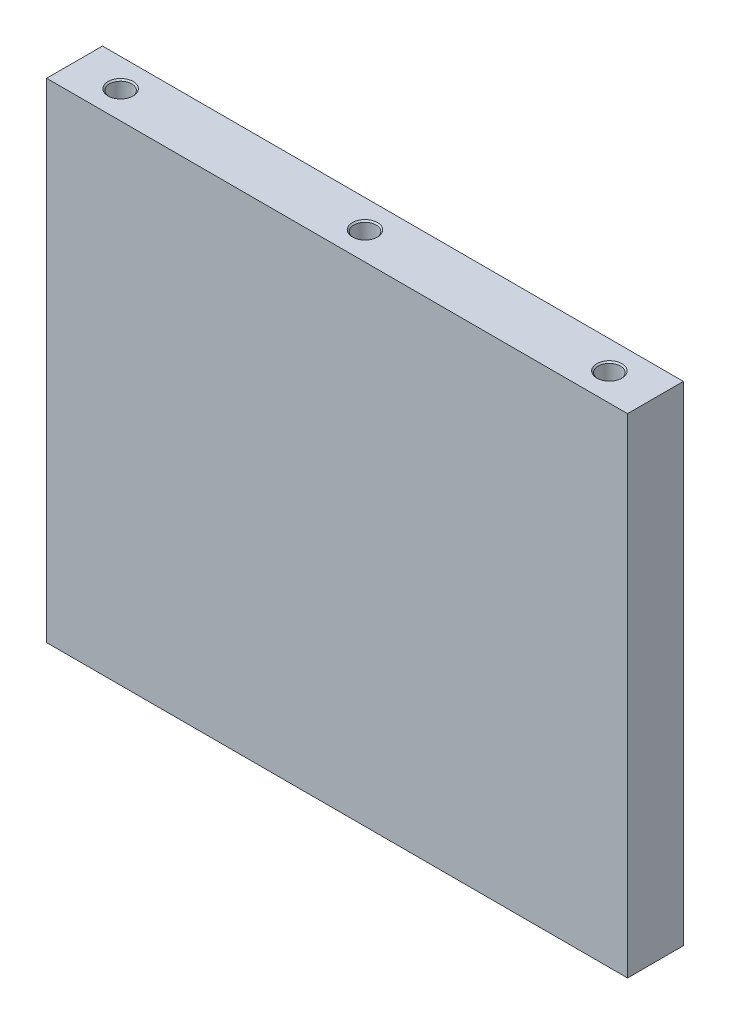
ISO-10303-21;
HEADER;
FILE_DESCRIPTION(('STEP AP214'),'2;1');
FILE_NAME('part.step','',(''),(''),'','','');
FILE_SCHEMA(('AUTOMOTIVE_DESIGN { 1 0 10303 214 1 1 1 1 }'));
ENDSEC;
DATA;
#1=APPLICATION_CONTEXT('core data for automotive mechanical design processes');
#2=APPLICATION_PROTOCOL_DEFINITION('international standard','automotive_design',2000,#1);
#3=PRODUCT_CONTEXT('',#1,'mechanical');
#4=PRODUCT('Part','Part','',(#3));
#5=PRODUCT_RELATED_PRODUCT_CATEGORY('part','',(#4));
#6=PRODUCT_DEFINITION_FORMATION('','',#4);
#7=PRODUCT_DEFINITION_CONTEXT('part definition',#1,'design');
#8=PRODUCT_DEFINITION('design','',#6,#7);
#9=PRODUCT_DEFINITION_SHAPE('','',#8);
#10=(LENGTH_UNIT() NAMED_UNIT(*) SI_UNIT(.MILLI.,.METRE.));
#11=(NAMED_UNIT(*) PLANE_ANGLE_UNIT() SI_UNIT($,.RADIAN.));
#12=(NAMED_UNIT(*) SI_UNIT($,.STERADIAN.) SOLID_ANGLE_UNIT());
#13=UNCERTAINTY_MEASURE_WITH_UNIT(LENGTH_MEASURE(1.E-05),#10,'distance_accuracy_value','');
#14=(GEOMETRIC_REPRESENTATION_CONTEXT(3) GLOBAL_UNCERTAINTY_ASSIGNED_CONTEXT((#13)) GLOBAL_UNIT_ASSIGNED_CONTEXT((#10,
#11,#12)) REPRESENTATION_CONTEXT('',''));
#15=CARTESIAN_POINT('',(0.,0.,0.));
#16=DIRECTION('',(0.,0.,1.));
#17=DIRECTION('',(1.,0.,0.));
#18=AXIS2_PLACEMENT_3D('',#15,#16,#17);
#19=CARTESIAN_POINT('',(-104.,175.,9.99999999999998));
#20=DIRECTION('',(1.,0.,0.));
#21=DIRECTION('',(0.,0.,-1.));
#22=AXIS2_PLACEMENT_3D('',#19,#20,#21);
#23=PLANE('',#22);
#24=DIRECTION('',(0.,0.,1.));
#25=VECTOR('',#24,1.);
#26=CARTESIAN_POINT('',(-104.,0.,9.99999999999998));
#27=LINE('',#26,#25);
#28=CARTESIAN_POINT('',(-104.,0.,-9.99999999999999));
#29=VERTEX_POINT('',#28);
#30=CARTESIAN_POINT('',(-104.,0.,9.99999999999998));
#31=VERTEX_POINT('',#30);
#32=EDGE_CURVE('E112',#29,#31,#27,.T.);
#33=ORIENTED_EDGE('',*,*,#32,.T.);
#34=DIRECTION('',(0.,-1.,0.));
#35=VECTOR('',#34,1.);
#36=CARTESIAN_POINT('',(-104.,175.,9.99999999999998));
#37=LINE('',#36,#35);
#38=CARTESIAN_POINT('',(-104.,175.,9.99999999999998));
#39=VERTEX_POINT('',#38);
#40=EDGE_CURVE('E103',#39,#31,#37,.T.);
#41=ORIENTED_EDGE('',*,*,#40,.F.);
#42=DIRECTION('',(0.,0.,1.));
#43=VECTOR('',#42,1.);
#44=CARTESIAN_POINT('',(-104.,175.,9.99999999999998));
#45=LINE('',#44,#43);
#46=CARTESIAN_POINT('',(-104.,175.,-9.99999999999999));
#47=VERTEX_POINT('',#46);
#48=EDGE_CURVE('E97',#47,#39,#45,.T.);
#49=ORIENTED_EDGE('',*,*,#48,.F.);
#50=DIRECTION('',(0.,-1.,0.));
#51=VECTOR('',#50,1.);
#52=CARTESIAN_POINT('',(-104.,175.,-9.99999999999999));
#53=LINE('',#52,#51);
#54=EDGE_CURVE('E108',#47,#29,#53,.T.);
#55=ORIENTED_EDGE('',*,*,#54,.T.);
#56=EDGE_LOOP('',(#33,#41,#49,#55));
#57=FACE_BOUND('',#56,.T.);
#58=ADVANCED_FACE('F44',(#57),#23,.F.);
#59=CARTESIAN_POINT('',(-104.,175.,9.99999999999998));
#60=DIRECTION('',(0.,0.,-1.));
#61=DIRECTION('',(-1.,0.,0.));
#62=AXIS2_PLACEMENT_3D('',#59,#60,#61);
#63=PLANE('',#62);
#64=DIRECTION('',(1.,0.,0.));
#65=VECTOR('',#64,1.);
#66=CARTESIAN_POINT('',(-104.,0.,9.99999999999998));
#67=LINE('',#66,#65);
#68=CARTESIAN_POINT('',(104.,0.,10.));
#69=VERTEX_POINT('',#68);
#70=EDGE_CURVE('E102',#31,#69,#67,.T.);
#71=ORIENTED_EDGE('',*,*,#70,.T.);
#72=DIRECTION('',(0.,-1.,0.));
#73=VECTOR('',#72,1.);
#74=CARTESIAN_POINT('',(104.,175.,10.));
#75=LINE('',#74,#73);
#76=CARTESIAN_POINT('',(104.,175.,10.));
#77=VERTEX_POINT('',#76);
#78=EDGE_CURVE('E100',#77,#69,#75,.T.);
#79=ORIENTED_EDGE('',*,*,#78,.F.);
#80=DIRECTION('',(1.,0.,0.));
#81=VECTOR('',#80,1.);
#82=CARTESIAN_POINT('',(-104.,175.,9.99999999999998));
#83=LINE('',#82,#81);
#84=EDGE_CURVE('E92',#39,#77,#83,.T.);
#85=ORIENTED_EDGE('',*,*,#84,.F.);
#86=ORIENTED_EDGE('',*,*,#40,.T.);
#87=EDGE_LOOP('',(#71,#79,#85,#86));
#88=FACE_BOUND('',#87,.T.);
#89=ADVANCED_FACE('F101',(#88),#63,.F.);
#90=CARTESIAN_POINT('',(104.,175.,10.));
#91=DIRECTION('',(-1.,0.,0.));
#92=DIRECTION('',(0.,0.,1.));
#93=AXIS2_PLACEMENT_3D('',#90,#91,#92);
#94=PLANE('',#93);
#95=DIRECTION('',(0.,0.,-1.));
#96=VECTOR('',#95,1.);
#97=CARTESIAN_POINT('',(104.,0.,10.));
#98=LINE('',#97,#96);
#99=CARTESIAN_POINT('',(104.,0.,-9.99999999999999));
#100=VERTEX_POINT('',#99);
#101=EDGE_CURVE('E78',#69,#100,#98,.T.);
#102=ORIENTED_EDGE('',*,*,#101,.T.);
#103=DIRECTION('',(0.,-1.,0.));
#104=VECTOR('',#103,1.);
#105=CARTESIAN_POINT('',(104.,175.,-9.99999999999999));
#106=LINE('',#105,#104);
#107=CARTESIAN_POINT('',(104.,175.,-9.99999999999999));
#108=VERTEX_POINT('',#107);
#109=EDGE_CURVE('E104',#108,#100,#106,.T.);
#110=ORIENTED_EDGE('',*,*,#109,.F.);
#111=DIRECTION('',(0.,0.,-1.));
#112=VECTOR('',#111,1.);
#113=CARTESIAN_POINT('',(104.,175.,10.));
#114=LINE('',#113,#112);
#115=EDGE_CURVE('E95',#77,#108,#114,.T.);
#116=ORIENTED_EDGE('',*,*,#115,.F.);
#117=ORIENTED_EDGE('',*,*,#78,.T.);
#118=EDGE_LOOP('',(#102,#110,#116,#117));
#119=FACE_BOUND('',#118,.T.);
#120=ADVANCED_FACE('F106',(#119),#94,.F.);
#121=CARTESIAN_POINT('',(-104.,175.,-9.99999999999999));
#122=DIRECTION('',(0.,0.,1.));
#123=DIRECTION('',(1.,0.,0.));
#124=AXIS2_PLACEMENT_3D('',#121,#122,#123);
#125=PLANE('',#124);
#126=DIRECTION('',(-1.,0.,0.));
#127=VECTOR('',#126,1.);
#128=CARTESIAN_POINT('',(-104.,0.,-9.99999999999999));
#129=LINE('',#128,#127);
#130=EDGE_CURVE('E84',#100,#29,#129,.T.);
#131=ORIENTED_EDGE('',*,*,#130,.T.);
#132=ORIENTED_EDGE('',*,*,#54,.F.);
#133=DIRECTION('',(-1.,0.,0.));
#134=VECTOR('',#133,1.);
#135=CARTESIAN_POINT('',(-104.,175.,-9.99999999999999));
#136=LINE('',#135,#134);
#137=EDGE_CURVE('E61',#108,#47,#136,.T.);
#138=ORIENTED_EDGE('',*,*,#137,.F.);
#139=ORIENTED_EDGE('',*,*,#109,.T.);
#140=EDGE_LOOP('',(#131,#132,#138,#139));
#141=FACE_BOUND('',#140,.T.);
#142=ADVANCED_FACE('F225',(#141),#125,.F.);
#143=CARTESIAN_POINT('',(0.,175.,0.));
#144=DIRECTION('',(0.,-1.,0.));
#145=DIRECTION('',(0.,0.,-1.));
#146=AXIS2_PLACEMENT_3D('',#143,#144,#145);
#147=PLANE('',#146);
#148=CARTESIAN_POINT('',(87.5,175.,0.));
#149=DIRECTION('',(0.,-1.,0.));
#150=DIRECTION('',(0.,0.,-1.));
#151=AXIS2_PLACEMENT_3D('',#148,#149,#150);
#152=CIRCLE('',#151,4.50000000000003);
#153=CARTESIAN_POINT('',(87.5,175.,-4.50000000000005));
#154=VERTEX_POINT('',#153);
#155=EDGE_CURVE('E143',#154,#154,#152,.T.);
#156=ORIENTED_EDGE('',*,*,#155,.T.);
#157=EDGE_LOOP('',(#156));
#158=FACE_BOUND('',#157,.T.);
#159=CARTESIAN_POINT('',(0.,175.,0.));
#160=DIRECTION('',(0.,-1.,0.));
#161=DIRECTION('',(0.,0.,-1.));
#162=AXIS2_PLACEMENT_3D('',#159,#160,#161);
#163=CIRCLE('',#162,4.50000000000003);
#164=CARTESIAN_POINT('',(0.,175.,-4.50000000000003));
#165=VERTEX_POINT('',#164);
#166=EDGE_CURVE('E140',#165,#165,#163,.T.);
#167=ORIENTED_EDGE('',*,*,#166,.T.);
#168=EDGE_LOOP('',(#167));
#169=FACE_BOUND('',#168,.T.);
#170=CARTESIAN_POINT('',(-87.5,175.,0.));
#171=DIRECTION('',(0.,-1.,0.));
#172=DIRECTION('',(0.,0.,-1.));
#173=AXIS2_PLACEMENT_3D('',#170,#171,#172);
#174=CIRCLE('',#173,4.50000000000003);
#175=CARTESIAN_POINT('',(-87.5,175.,-4.50000000000003));
#176=VERTEX_POINT('',#175);
#177=EDGE_CURVE('E137',#176,#176,#174,.T.);
#178=ORIENTED_EDGE('',*,*,#177,.T.);
#179=EDGE_LOOP('',(#178));
#180=FACE_BOUND('',#179,.T.);
#181=ORIENTED_EDGE('',*,*,#48,.T.);
#182=ORIENTED_EDGE('',*,*,#84,.T.);
#183=ORIENTED_EDGE('',*,*,#115,.T.);
#184=ORIENTED_EDGE('',*,*,#137,.T.);
#185=EDGE_LOOP('',(#181,#182,#183,#184));
#186=FACE_BOUND('',#185,.T.);
#187=ADVANCED_FACE('F93',(#158,#169,#180,#186),#147,.F.);
#188=CARTESIAN_POINT('',(0.,0.,0.));
#189=DIRECTION('',(0.,-1.,0.));
#190=DIRECTION('',(0.,0.,-1.));
#191=AXIS2_PLACEMENT_3D('',#188,#189,#190);
#192=PLANE('',#191);
#193=CARTESIAN_POINT('',(-55.,0.,0.));
#194=DIRECTION('',(0.,-1.,0.));
#195=DIRECTION('',(0.,0.,-1.));
#196=AXIS2_PLACEMENT_3D('',#193,#194,#195);
#197=CIRCLE('',#196,4.49999999999998);
#198=CARTESIAN_POINT('',(-55.,0.,-4.49999999999998));
#199=VERTEX_POINT('',#198);
#200=EDGE_CURVE('E128',#199,#199,#197,.F.);
#201=ORIENTED_EDGE('',*,*,#200,.T.);
#202=EDGE_LOOP('',(#201));
#203=FACE_BOUND('',#202,.T.);
#204=CARTESIAN_POINT('',(55.,0.,0.));
#205=DIRECTION('',(0.,-1.,0.));
#206=DIRECTION('',(0.,0.,-1.));
#207=AXIS2_PLACEMENT_3D('',#204,#205,#206);
#208=CIRCLE('',#207,4.49999999999998);
#209=CARTESIAN_POINT('',(55.,0.,-4.49999999999998));
#210=VERTEX_POINT('',#209);
#211=EDGE_CURVE('E125',#210,#210,#208,.F.);
#212=ORIENTED_EDGE('',*,*,#211,.T.);
#213=EDGE_LOOP('',(#212));
#214=FACE_BOUND('',#213,.T.);
#215=ORIENTED_EDGE('',*,*,#32,.F.);
#216=ORIENTED_EDGE('',*,*,#130,.F.);
#217=ORIENTED_EDGE('',*,*,#101,.F.);
#218=ORIENTED_EDGE('',*,*,#70,.F.);
#219=EDGE_LOOP('',(#215,#216,#217,#218));
#220=FACE_BOUND('',#219,.T.);
#221=ADVANCED_FACE('F212',(#203,#214,#220),#192,.T.);
#222=CARTESIAN_POINT('',(0.,163.,0.));
#223=DIRECTION('',(0.,1.,0.));
#224=DIRECTION('',(0.,0.,1.));
#225=AXIS2_PLACEMENT_3D('',#222,#223,#224);
#226=CYLINDRICAL_SURFACE('',#225,4.);
#227=CARTESIAN_POINT('',(0.,174.5,0.));
#228=DIRECTION('',(0.,-1.,0.));
#229=DIRECTION('',(0.,0.,-1.));
#230=AXIS2_PLACEMENT_3D('',#227,#228,#229);
#231=CIRCLE('',#230,4.);
#232=CARTESIAN_POINT('',(0.,174.5,-4.));
#233=VERTEX_POINT('',#232);
#234=EDGE_CURVE('E53',#233,#233,#231,.F.);
#235=ORIENTED_EDGE('',*,*,#234,.T.);
#236=EDGE_LOOP('',(#235));
#237=FACE_BOUND('',#236,.T.);
#238=CARTESIAN_POINT('',(0.,163.,0.));
#239=DIRECTION('',(0.,1.,0.));
#240=DIRECTION('',(0.,0.,1.));
#241=AXIS2_PLACEMENT_3D('',#238,#239,#240);
#242=CIRCLE('',#241,4.);
#243=CARTESIAN_POINT('',(0.,163.,4.));
#244=VERTEX_POINT('',#243);
#245=EDGE_CURVE('E115',#244,#244,#242,.T.);
#246=ORIENTED_EDGE('',*,*,#245,.F.);
#247=EDGE_LOOP('',(#246));
#248=FACE_BOUND('',#247,.T.);
#249=ADVANCED_FACE('F148',(#237,#248),#226,.F.);
#250=CARTESIAN_POINT('',(0.,163.,0.));
#251=DIRECTION('',(0.,1.,0.));
#252=DIRECTION('',(0.,0.,1.));
#253=AXIS2_PLACEMENT_3D('',#250,#251,#252);
#254=PLANE('',#253);
#255=ORIENTED_EDGE('',*,*,#245,.T.);
#256=EDGE_LOOP('',(#255));
#257=FACE_BOUND('',#256,.T.);
#258=ADVANCED_FACE('F210',(#257),#254,.T.);
#259=CARTESIAN_POINT('',(-87.5,163.,0.));
#260=DIRECTION('',(0.,1.,0.));
#261=DIRECTION('',(0.,0.,1.));
#262=AXIS2_PLACEMENT_3D('',#259,#260,#261);
#263=CYLINDRICAL_SURFACE('',#262,4.00000000000001);
#264=CARTESIAN_POINT('',(-87.5,174.5,0.));
#265=DIRECTION('',(0.,-1.,0.));
#266=DIRECTION('',(0.,0.,-1.));
#267=AXIS2_PLACEMENT_3D('',#264,#265,#266);
#268=CIRCLE('',#267,4.00000000000001);
#269=CARTESIAN_POINT('',(-87.5,174.5,-4.00000000000001));
#270=VERTEX_POINT('',#269);
#271=EDGE_CURVE('E13',#270,#270,#268,.F.);
#272=ORIENTED_EDGE('',*,*,#271,.T.);
#273=EDGE_LOOP('',(#272));
#274=FACE_BOUND('',#273,.T.);
#275=CARTESIAN_POINT('',(-87.5,163.,0.));
#276=DIRECTION('',(0.,1.,0.));
#277=DIRECTION('',(0.,0.,1.));
#278=AXIS2_PLACEMENT_3D('',#275,#276,#277);
#279=CIRCLE('',#278,4.00000000000001);
#280=CARTESIAN_POINT('',(-87.5,163.,4.00000000000001));
#281=VERTEX_POINT('',#280);
#282=EDGE_CURVE('E202',#281,#281,#279,.T.);
#283=ORIENTED_EDGE('',*,*,#282,.F.);
#284=EDGE_LOOP('',(#283));
#285=FACE_BOUND('',#284,.T.);
#286=ADVANCED_FACE('F218',(#274,#285),#263,.F.);
#287=CARTESIAN_POINT('',(-87.5,163.,0.));
#288=DIRECTION('',(0.,1.,0.));
#289=DIRECTION('',(0.,0.,1.));
#290=AXIS2_PLACEMENT_3D('',#287,#288,#289);
#291=PLANE('',#290);
#292=ORIENTED_EDGE('',*,*,#282,.T.);
#293=EDGE_LOOP('',(#292));
#294=FACE_BOUND('',#293,.T.);
#295=ADVANCED_FACE('F262',(#294),#291,.T.);
#296=CARTESIAN_POINT('',(87.5,163.,0.));
#297=DIRECTION('',(0.,1.,0.));
#298=DIRECTION('',(0.,0.,1.));
#299=AXIS2_PLACEMENT_3D('',#296,#297,#298);
#300=CYLINDRICAL_SURFACE('',#299,4.00000000000001);
#301=CARTESIAN_POINT('',(87.5,174.5,0.));
#302=DIRECTION('',(0.,-1.,0.));
#303=DIRECTION('',(0.,0.,-1.));
#304=AXIS2_PLACEMENT_3D('',#301,#302,#303);
#305=CIRCLE('',#304,4.00000000000001);
#306=CARTESIAN_POINT('',(87.5,174.5,-4.00000000000003));
#307=VERTEX_POINT('',#306);
#308=EDGE_CURVE('E134',#307,#307,#305,.F.);
#309=ORIENTED_EDGE('',*,*,#308,.T.);
#310=EDGE_LOOP('',(#309));
#311=FACE_BOUND('',#310,.T.);
#312=CARTESIAN_POINT('',(87.5,163.,0.));
#313=DIRECTION('',(0.,1.,0.));
#314=DIRECTION('',(0.,0.,-1.));
#315=AXIS2_PLACEMENT_3D('',#312,#313,#314);
#316=CIRCLE('',#315,4.00000000000001);
#317=CARTESIAN_POINT('',(87.5,163.,-4.00000000000003));
#318=VERTEX_POINT('',#317);
#319=EDGE_CURVE('E199',#318,#318,#316,.T.);
#320=ORIENTED_EDGE('',*,*,#319,.F.);
#321=EDGE_LOOP('',(#320));
#322=FACE_BOUND('',#321,.T.);
#323=ADVANCED_FACE('F270',(#311,#322),#300,.F.);
#324=CARTESIAN_POINT('',(87.5,163.,0.));
#325=DIRECTION('',(0.,-1.,0.));
#326=DIRECTION('',(0.,0.,-1.));
#327=AXIS2_PLACEMENT_3D('',#324,#325,#326);
#328=PLANE('',#327);
#329=ORIENTED_EDGE('',*,*,#319,.T.);
#330=EDGE_LOOP('',(#329));
#331=FACE_BOUND('',#330,.T.);
#332=ADVANCED_FACE('F190',(#331),#328,.F.);
#333=CARTESIAN_POINT('',(55.,15.,0.));
#334=DIRECTION('',(0.,-1.,0.));
#335=DIRECTION('',(0.,0.,-1.));
#336=AXIS2_PLACEMENT_3D('',#333,#334,#335);
#337=CYLINDRICAL_SURFACE('',#336,4.00000000000001);
#338=CARTESIAN_POINT('',(55.,0.499999999999955,0.));
#339=DIRECTION('',(0.,-1.,0.));
#340=DIRECTION('',(0.,0.,-1.));
#341=AXIS2_PLACEMENT_3D('',#338,#339,#340);
#342=CIRCLE('',#341,4.00000000000001);
#343=CARTESIAN_POINT('',(55.,0.499999999999955,-4.00000000000001));
#344=VERTEX_POINT('',#343);
#345=EDGE_CURVE('E131',#344,#344,#342,.T.);
#346=ORIENTED_EDGE('',*,*,#345,.T.);
#347=EDGE_LOOP('',(#346));
#348=FACE_BOUND('',#347,.T.);
#349=CARTESIAN_POINT('',(55.,15.,0.));
#350=DIRECTION('',(0.,-1.,0.));
#351=DIRECTION('',(0.,0.,1.));
#352=AXIS2_PLACEMENT_3D('',#349,#350,#351);
#353=CIRCLE('',#352,4.00000000000001);
#354=CARTESIAN_POINT('',(55.,15.,4.00000000000001));
#355=VERTEX_POINT('',#354);
#356=EDGE_CURVE('E194',#355,#355,#353,.T.);
#357=ORIENTED_EDGE('',*,*,#356,.F.);
#358=EDGE_LOOP('',(#357));
#359=FACE_BOUND('',#358,.T.);
#360=ADVANCED_FACE('F186',(#348,#359),#337,.F.);
#361=CARTESIAN_POINT('',(55.,15.,0.));
#362=DIRECTION('',(0.,1.,0.));
#363=DIRECTION('',(0.,0.,1.));
#364=AXIS2_PLACEMENT_3D('',#361,#362,#363);
#365=PLANE('',#364);
#366=ORIENTED_EDGE('',*,*,#356,.T.);
#367=EDGE_LOOP('',(#366));
#368=FACE_BOUND('',#367,.T.);
#369=ADVANCED_FACE('F189',(#368),#365,.F.);
#370=CARTESIAN_POINT('',(-55.,15.,0.));
#371=DIRECTION('',(0.,-1.,0.));
#372=DIRECTION('',(0.,0.,-1.));
#373=AXIS2_PLACEMENT_3D('',#370,#371,#372);
#374=CYLINDRICAL_SURFACE('',#373,4.00000000000001);
#375=CARTESIAN_POINT('',(-55.,0.499999999999955,0.));
#376=DIRECTION('',(0.,-1.,0.));
#377=DIRECTION('',(0.,0.,-1.));
#378=AXIS2_PLACEMENT_3D('',#375,#376,#377);
#379=CIRCLE('',#378,4.00000000000001);
#380=CARTESIAN_POINT('',(-55.,0.499999999999955,-4.00000000000001));
#381=VERTEX_POINT('',#380);
#382=EDGE_CURVE('E122',#381,#381,#379,.T.);
#383=ORIENTED_EDGE('',*,*,#382,.T.);
#384=EDGE_LOOP('',(#383));
#385=FACE_BOUND('',#384,.T.);
#386=CARTESIAN_POINT('',(-55.,15.,0.));
#387=DIRECTION('',(0.,-1.,0.));
#388=DIRECTION('',(0.,0.,-1.));
#389=AXIS2_PLACEMENT_3D('',#386,#387,#388);
#390=CIRCLE('',#389,4.00000000000001);
#391=CARTESIAN_POINT('',(-55.,15.,-4.00000000000001));
#392=VERTEX_POINT('',#391);
#393=EDGE_CURVE('E196',#392,#392,#390,.T.);
#394=ORIENTED_EDGE('',*,*,#393,.F.);
#395=EDGE_LOOP('',(#394));
#396=FACE_BOUND('',#395,.T.);
#397=ADVANCED_FACE('F289',(#385,#396),#374,.F.);
#398=CARTESIAN_POINT('',(-55.,15.,0.));
#399=DIRECTION('',(0.,-1.,0.));
#400=DIRECTION('',(0.,0.,-1.));
#401=AXIS2_PLACEMENT_3D('',#398,#399,#400);
#402=PLANE('',#401);
#403=ORIENTED_EDGE('',*,*,#393,.T.);
#404=EDGE_LOOP('',(#403));
#405=FACE_BOUND('',#404,.T.);
#406=ADVANCED_FACE('F176',(#405),#402,.T.);
#407=CARTESIAN_POINT('',(-55.,0.499999999999955,0.));
#408=DIRECTION('',(0.,-1.,0.));
#409=DIRECTION('',(0.,0.,-1.));
#410=AXIS2_PLACEMENT_3D('',#407,#408,#409);
#411=CONICAL_SURFACE('',#410,4.00000000000001,0.785398163397463);
#412=ORIENTED_EDGE('',*,*,#200,.F.);
#413=EDGE_LOOP('',(#412));
#414=FACE_BOUND('',#413,.T.);
#415=ORIENTED_EDGE('',*,*,#382,.F.);
#416=EDGE_LOOP('',(#415));
#417=FACE_BOUND('',#416,.T.);
#418=ADVANCED_FACE('F173',(#414,#417),#411,.F.);
#419=CARTESIAN_POINT('',(55.,0.499999999999955,0.));
#420=DIRECTION('',(0.,-1.,0.));
#421=DIRECTION('',(0.,0.,-1.));
#422=AXIS2_PLACEMENT_3D('',#419,#420,#421);
#423=CONICAL_SURFACE('',#422,4.00000000000001,0.785398163397463);
#424=ORIENTED_EDGE('',*,*,#211,.F.);
#425=EDGE_LOOP('',(#424));
#426=FACE_BOUND('',#425,.T.);
#427=ORIENTED_EDGE('',*,*,#345,.F.);
#428=EDGE_LOOP('',(#427));
#429=FACE_BOUND('',#428,.T.);
#430=ADVANCED_FACE('F160',(#426,#429),#423,.F.);
#431=CARTESIAN_POINT('',(87.5,174.5,0.));
#432=DIRECTION('',(0.,1.,0.));
#433=DIRECTION('',(0.,0.,1.));
#434=AXIS2_PLACEMENT_3D('',#431,#432,#433);
#435=CONICAL_SURFACE('',#434,4.00000000000001,0.785398163397473);
#436=ORIENTED_EDGE('',*,*,#155,.F.);
#437=EDGE_LOOP('',(#436));
#438=FACE_BOUND('',#437,.T.);
#439=ORIENTED_EDGE('',*,*,#308,.F.);
#440=EDGE_LOOP('',(#439));
#441=FACE_BOUND('',#440,.T.);
#442=ADVANCED_FACE('F153',(#438,#441),#435,.F.);
#443=CARTESIAN_POINT('',(0.,174.5,0.));
#444=DIRECTION('',(0.,1.,0.));
#445=DIRECTION('',(0.,0.,1.));
#446=AXIS2_PLACEMENT_3D('',#443,#444,#445);
#447=CONICAL_SURFACE('',#446,4.,0.785398163397452);
#448=ORIENTED_EDGE('',*,*,#166,.F.);
#449=EDGE_LOOP('',(#448));
#450=FACE_BOUND('',#449,.T.);
#451=ORIENTED_EDGE('',*,*,#234,.F.);
#452=EDGE_LOOP('',(#451));
#453=FACE_BOUND('',#452,.T.);
#454=ADVANCED_FACE('F151',(#450,#453),#447,.F.);
#455=CARTESIAN_POINT('',(-87.5,174.5,0.));
#456=DIRECTION('',(0.,1.,0.));
#457=DIRECTION('',(0.,0.,1.));
#458=AXIS2_PLACEMENT_3D('',#455,#456,#457);
#459=CONICAL_SURFACE('',#458,4.00000000000001,0.785398163397473);
#460=ORIENTED_EDGE('',*,*,#177,.F.);
#461=EDGE_LOOP('',(#460));
#462=FACE_BOUND('',#461,.T.);
#463=ORIENTED_EDGE('',*,*,#271,.F.);
#464=EDGE_LOOP('',(#463));
#465=FACE_BOUND('',#464,.T.);
#466=ADVANCED_FACE('F46',(#462,#465),#459,.F.);
#467=CLOSED_SHELL('',(#58,#89,#120,#142,#187,#221,#249,#258,#286,#295,#323,#332,#360,#369,#397,
#406,#418,#430,#442,#454,#466));
#468=MANIFOLD_SOLID_BREP('B2',#467);
#469=ADVANCED_BREP_SHAPE_REPRESENTATION('',(#18,#468),#14);
#470=SHAPE_DEFINITION_REPRESENTATION(#9,#469);
ENDSEC;
END-ISO-10303-21;
